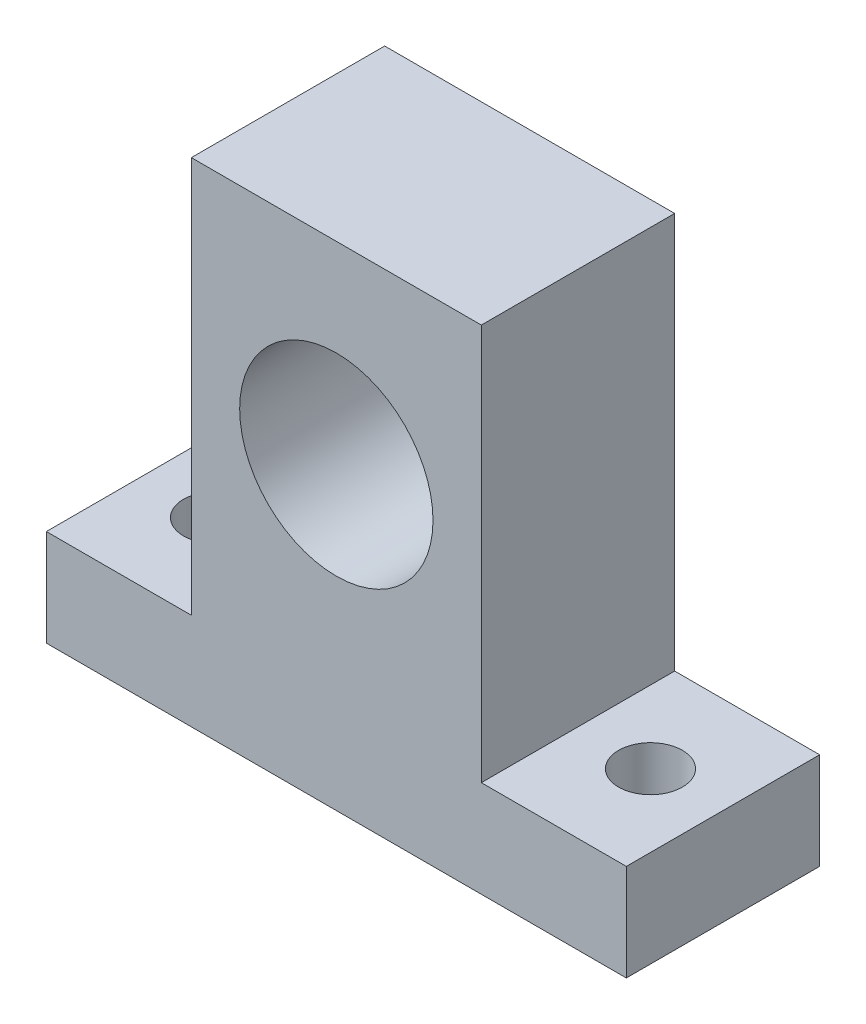
ISO-10303-21;
HEADER;
FILE_DESCRIPTION(('STEP AP214'),'2;1');
FILE_NAME('part.step','',(''),(''),'','','');
FILE_SCHEMA(('AUTOMOTIVE_DESIGN { 1 0 10303 214 1 1 1 1 }'));
ENDSEC;
DATA;
#1=APPLICATION_CONTEXT('core data for automotive mechanical design processes');
#2=APPLICATION_PROTOCOL_DEFINITION('international standard','automotive_design',2000,#1);
#3=PRODUCT_CONTEXT('',#1,'mechanical');
#4=PRODUCT('Part','Part','',(#3));
#5=PRODUCT_RELATED_PRODUCT_CATEGORY('part','',(#4));
#6=PRODUCT_DEFINITION_FORMATION('','',#4);
#7=PRODUCT_DEFINITION_CONTEXT('part definition',#1,'design');
#8=PRODUCT_DEFINITION('design','',#6,#7);
#9=PRODUCT_DEFINITION_SHAPE('','',#8);
#10=(LENGTH_UNIT() NAMED_UNIT(*) SI_UNIT(.MILLI.,.METRE.));
#11=(NAMED_UNIT(*) PLANE_ANGLE_UNIT() SI_UNIT($,.RADIAN.));
#12=(NAMED_UNIT(*) SI_UNIT($,.STERADIAN.) SOLID_ANGLE_UNIT());
#13=UNCERTAINTY_MEASURE_WITH_UNIT(LENGTH_MEASURE(1.E-05),#10,'distance_accuracy_value','');
#14=(GEOMETRIC_REPRESENTATION_CONTEXT(3) GLOBAL_UNCERTAINTY_ASSIGNED_CONTEXT((#13)) GLOBAL_UNIT_ASSIGNED_CONTEXT((#10,
#11,#12)) REPRESENTATION_CONTEXT('',''));
#15=CARTESIAN_POINT('',(0.,0.,0.));
#16=DIRECTION('',(0.,0.,1.));
#17=DIRECTION('',(1.,0.,0.));
#18=AXIS2_PLACEMENT_3D('',#15,#16,#17);
#19=CARTESIAN_POINT('',(0.,0.,20.));
#20=DIRECTION('',(0.,0.,1.));
#21=DIRECTION('',(1.,0.,0.));
#22=AXIS2_PLACEMENT_3D('',#19,#20,#21);
#23=PLANE('',#22);
#24=DIRECTION('',(-1.,0.,0.));
#25=VECTOR('',#24,1.);
#26=CARTESIAN_POINT('',(-15.,10.,20.));
#27=LINE('',#26,#25);
#28=CARTESIAN_POINT('',(-15.,10.,20.));
#29=VERTEX_POINT('',#28);
#30=CARTESIAN_POINT('',(-30.,9.99999999999999,20.));
#31=VERTEX_POINT('',#30);
#32=EDGE_CURVE('E164',#29,#31,#27,.T.);
#33=ORIENTED_EDGE('',*,*,#32,.T.);
#34=DIRECTION('',(0.,-1.,0.));
#35=VECTOR('',#34,1.);
#36=CARTESIAN_POINT('',(-30.,9.99999999999999,20.));
#37=LINE('',#36,#35);
#38=CARTESIAN_POINT('',(-30.,0.,20.));
#39=VERTEX_POINT('',#38);
#40=EDGE_CURVE('E100',#31,#39,#37,.T.);
#41=ORIENTED_EDGE('',*,*,#40,.T.);
#42=DIRECTION('',(1.,0.,0.));
#43=VECTOR('',#42,1.);
#44=CARTESIAN_POINT('',(30.,0.,20.));
#45=LINE('',#44,#43);
#46=CARTESIAN_POINT('',(30.,0.,20.));
#47=VERTEX_POINT('',#46);
#48=EDGE_CURVE('E186',#39,#47,#45,.T.);
#49=ORIENTED_EDGE('',*,*,#48,.T.);
#50=DIRECTION('',(0.,1.,0.));
#51=VECTOR('',#50,1.);
#52=CARTESIAN_POINT('',(30.,10.,20.));
#53=LINE('',#52,#51);
#54=CARTESIAN_POINT('',(30.,10.,20.));
#55=VERTEX_POINT('',#54);
#56=EDGE_CURVE('E200',#47,#55,#53,.T.);
#57=ORIENTED_EDGE('',*,*,#56,.T.);
#58=DIRECTION('',(-1.,0.,0.));
#59=VECTOR('',#58,1.);
#60=CARTESIAN_POINT('',(15.,10.,20.));
#61=LINE('',#60,#59);
#62=CARTESIAN_POINT('',(15.,10.,20.));
#63=VERTEX_POINT('',#62);
#64=EDGE_CURVE('E119',#55,#63,#61,.T.);
#65=ORIENTED_EDGE('',*,*,#64,.T.);
#66=DIRECTION('',(0.,1.,0.));
#67=VECTOR('',#66,1.);
#68=CARTESIAN_POINT('',(15.,51.,20.));
#69=LINE('',#68,#67);
#70=CARTESIAN_POINT('',(15.,51.,20.));
#71=VERTEX_POINT('',#70);
#72=EDGE_CURVE('E113',#63,#71,#69,.T.);
#73=ORIENTED_EDGE('',*,*,#72,.T.);
#74=DIRECTION('',(-1.,0.,0.));
#75=VECTOR('',#74,1.);
#76=CARTESIAN_POINT('',(-15.,51.,20.));
#77=LINE('',#76,#75);
#78=CARTESIAN_POINT('',(-15.,51.,20.));
#79=VERTEX_POINT('',#78);
#80=EDGE_CURVE('E117',#71,#79,#77,.T.);
#81=ORIENTED_EDGE('',*,*,#80,.T.);
#82=DIRECTION('',(0.,-1.,0.));
#83=VECTOR('',#82,1.);
#84=CARTESIAN_POINT('',(-15.,51.,20.));
#85=LINE('',#84,#83);
#86=EDGE_CURVE('E57',#79,#29,#85,.T.);
#87=ORIENTED_EDGE('',*,*,#86,.T.);
#88=EDGE_LOOP('',(#33,#41,#49,#57,#65,#73,#81,#87));
#89=FACE_BOUND('',#88,.T.);
#90=CARTESIAN_POINT('',(0.,31.,20.));
#91=DIRECTION('',(0.,0.,1.));
#92=DIRECTION('',(1.,0.,0.));
#93=AXIS2_PLACEMENT_3D('',#90,#91,#92);
#94=CIRCLE('',#93,10.);
#95=CARTESIAN_POINT('',(10.,31.,20.));
#96=VERTEX_POINT('',#95);
#97=EDGE_CURVE('E146',#96,#96,#94,.T.);
#98=ORIENTED_EDGE('',*,*,#97,.F.);
#99=EDGE_LOOP('',(#98));
#100=FACE_BOUND('',#99,.T.);
#101=ADVANCED_FACE('F38',(#89,#100),#23,.T.);
#102=CARTESIAN_POINT('',(0.,0.,0.));
#103=DIRECTION('',(0.,0.,1.));
#104=DIRECTION('',(1.,0.,0.));
#105=AXIS2_PLACEMENT_3D('',#102,#103,#104);
#106=PLANE('',#105);
#107=DIRECTION('',(-1.,0.,0.));
#108=VECTOR('',#107,1.);
#109=CARTESIAN_POINT('',(-15.,10.,0.));
#110=LINE('',#109,#108);
#111=CARTESIAN_POINT('',(-15.,10.,0.));
#112=VERTEX_POINT('',#111);
#113=CARTESIAN_POINT('',(-30.,9.99999999999999,0.));
#114=VERTEX_POINT('',#113);
#115=EDGE_CURVE('E141',#112,#114,#110,.T.);
#116=ORIENTED_EDGE('',*,*,#115,.F.);
#117=DIRECTION('',(0.,-1.,0.));
#118=VECTOR('',#117,1.);
#119=CARTESIAN_POINT('',(-15.,51.,0.));
#120=LINE('',#119,#118);
#121=CARTESIAN_POINT('',(-15.,51.,0.));
#122=VERTEX_POINT('',#121);
#123=EDGE_CURVE('E92',#122,#112,#120,.T.);
#124=ORIENTED_EDGE('',*,*,#123,.F.);
#125=DIRECTION('',(-1.,0.,0.));
#126=VECTOR('',#125,1.);
#127=CARTESIAN_POINT('',(-15.,51.,0.));
#128=LINE('',#127,#126);
#129=CARTESIAN_POINT('',(15.,51.,0.));
#130=VERTEX_POINT('',#129);
#131=EDGE_CURVE('E86',#130,#122,#128,.T.);
#132=ORIENTED_EDGE('',*,*,#131,.F.);
#133=DIRECTION('',(0.,1.,0.));
#134=VECTOR('',#133,1.);
#135=CARTESIAN_POINT('',(15.,51.,0.));
#136=LINE('',#135,#134);
#137=CARTESIAN_POINT('',(15.,10.,0.));
#138=VERTEX_POINT('',#137);
#139=EDGE_CURVE('E128',#138,#130,#136,.T.);
#140=ORIENTED_EDGE('',*,*,#139,.F.);
#141=DIRECTION('',(-1.,0.,0.));
#142=VECTOR('',#141,1.);
#143=CARTESIAN_POINT('',(15.,10.,0.));
#144=LINE('',#143,#142);
#145=CARTESIAN_POINT('',(30.,10.,0.));
#146=VERTEX_POINT('',#145);
#147=EDGE_CURVE('E155',#146,#138,#144,.T.);
#148=ORIENTED_EDGE('',*,*,#147,.F.);
#149=DIRECTION('',(0.,1.,0.));
#150=VECTOR('',#149,1.);
#151=CARTESIAN_POINT('',(30.,10.,0.));
#152=LINE('',#151,#150);
#153=CARTESIAN_POINT('',(30.,0.,0.));
#154=VERTEX_POINT('',#153);
#155=EDGE_CURVE('E152',#154,#146,#152,.T.);
#156=ORIENTED_EDGE('',*,*,#155,.F.);
#157=DIRECTION('',(1.,0.,0.));
#158=VECTOR('',#157,1.);
#159=CARTESIAN_POINT('',(30.,0.,0.));
#160=LINE('',#159,#158);
#161=CARTESIAN_POINT('',(-30.,0.,0.));
#162=VERTEX_POINT('',#161);
#163=EDGE_CURVE('E149',#162,#154,#160,.T.);
#164=ORIENTED_EDGE('',*,*,#163,.F.);
#165=DIRECTION('',(0.,-1.,0.));
#166=VECTOR('',#165,1.);
#167=CARTESIAN_POINT('',(-30.,9.99999999999999,0.));
#168=LINE('',#167,#166);
#169=EDGE_CURVE('E145',#114,#162,#168,.T.);
#170=ORIENTED_EDGE('',*,*,#169,.F.);
#171=EDGE_LOOP('',(#116,#124,#132,#140,#148,#156,#164,#170));
#172=FACE_BOUND('',#171,.T.);
#173=CARTESIAN_POINT('',(0.,31.,0.));
#174=DIRECTION('',(0.,0.,1.));
#175=DIRECTION('',(1.,0.,0.));
#176=AXIS2_PLACEMENT_3D('',#173,#174,#175);
#177=CIRCLE('',#176,10.);
#178=CARTESIAN_POINT('',(10.,31.,0.));
#179=VERTEX_POINT('',#178);
#180=EDGE_CURVE('E210',#179,#179,#177,.T.);
#181=ORIENTED_EDGE('',*,*,#180,.T.);
#182=EDGE_LOOP('',(#181));
#183=FACE_BOUND('',#182,.T.);
#184=ADVANCED_FACE('F190',(#172,#183),#106,.F.);
#185=CARTESIAN_POINT('',(-15.,10.,20.));
#186=DIRECTION('',(0.,-1.,0.));
#187=DIRECTION('',(1.,0.,0.));
#188=AXIS2_PLACEMENT_3D('',#185,#186,#187);
#189=PLANE('',#188);
#190=CARTESIAN_POINT('',(-22.5,9.99999999999999,10.));
#191=DIRECTION('',(0.,-1.,0.));
#192=DIRECTION('',(1.,0.,0.));
#193=AXIS2_PLACEMENT_3D('',#190,#191,#192);
#194=CIRCLE('',#193,3.3);
#195=CARTESIAN_POINT('',(-19.2,9.99999999999999,10.));
#196=VERTEX_POINT('',#195);
#197=EDGE_CURVE('E214',#196,#196,#194,.T.);
#198=ORIENTED_EDGE('',*,*,#197,.T.);
#199=EDGE_LOOP('',(#198));
#200=FACE_BOUND('',#199,.T.);
#201=ORIENTED_EDGE('',*,*,#115,.T.);
#202=DIRECTION('',(0.,0.,-1.));
#203=VECTOR('',#202,1.);
#204=CARTESIAN_POINT('',(-30.,9.99999999999999,20.));
#205=LINE('',#204,#203);
#206=EDGE_CURVE('E11',#31,#114,#205,.T.);
#207=ORIENTED_EDGE('',*,*,#206,.F.);
#208=ORIENTED_EDGE('',*,*,#32,.F.);
#209=DIRECTION('',(0.,0.,-1.));
#210=VECTOR('',#209,1.);
#211=CARTESIAN_POINT('',(-15.,10.,20.));
#212=LINE('',#211,#210);
#213=EDGE_CURVE('E137',#29,#112,#212,.T.);
#214=ORIENTED_EDGE('',*,*,#213,.T.);
#215=EDGE_LOOP('',(#201,#207,#208,#214));
#216=FACE_BOUND('',#215,.T.);
#217=ADVANCED_FACE('F40',(#200,#216),#189,.F.);
#218=CARTESIAN_POINT('',(-30.,9.99999999999999,20.));
#219=DIRECTION('',(1.,0.,0.));
#220=DIRECTION('',(0.,0.,-1.));
#221=AXIS2_PLACEMENT_3D('',#218,#219,#220);
#222=PLANE('',#221);
#223=ORIENTED_EDGE('',*,*,#169,.T.);
#224=DIRECTION('',(0.,0.,-1.));
#225=VECTOR('',#224,1.);
#226=CARTESIAN_POINT('',(-30.,0.,20.));
#227=LINE('',#226,#225);
#228=EDGE_CURVE('E49',#39,#162,#227,.T.);
#229=ORIENTED_EDGE('',*,*,#228,.F.);
#230=ORIENTED_EDGE('',*,*,#40,.F.);
#231=ORIENTED_EDGE('',*,*,#206,.T.);
#232=EDGE_LOOP('',(#223,#229,#230,#231));
#233=FACE_BOUND('',#232,.T.);
#234=ADVANCED_FACE('F269',(#233),#222,.F.);
#235=CARTESIAN_POINT('',(30.,0.,20.));
#236=DIRECTION('',(0.,1.,0.));
#237=DIRECTION('',(-1.,0.,0.));
#238=AXIS2_PLACEMENT_3D('',#235,#236,#237);
#239=PLANE('',#238);
#240=CARTESIAN_POINT('',(-22.5,0.,10.));
#241=DIRECTION('',(0.,1.,0.));
#242=DIRECTION('',(-1.,0.,0.));
#243=AXIS2_PLACEMENT_3D('',#240,#241,#242);
#244=CIRCLE('',#243,3.3);
#245=CARTESIAN_POINT('',(-25.8,0.,10.));
#246=VERTEX_POINT('',#245);
#247=EDGE_CURVE('E225',#246,#246,#244,.T.);
#248=ORIENTED_EDGE('',*,*,#247,.T.);
#249=EDGE_LOOP('',(#248));
#250=FACE_BOUND('',#249,.T.);
#251=CARTESIAN_POINT('',(22.5,0.,9.99999999999999));
#252=DIRECTION('',(0.,1.,0.));
#253=DIRECTION('',(1.,0.,0.));
#254=AXIS2_PLACEMENT_3D('',#251,#252,#253);
#255=CIRCLE('',#254,3.3);
#256=CARTESIAN_POINT('',(25.8,0.,9.99999999999999));
#257=VERTEX_POINT('',#256);
#258=EDGE_CURVE('E221',#257,#257,#255,.T.);
#259=ORIENTED_EDGE('',*,*,#258,.T.);
#260=EDGE_LOOP('',(#259));
#261=FACE_BOUND('',#260,.T.);
#262=ORIENTED_EDGE('',*,*,#163,.T.);
#263=DIRECTION('',(0.,0.,-1.));
#264=VECTOR('',#263,1.);
#265=CARTESIAN_POINT('',(30.,0.,20.));
#266=LINE('',#265,#264);
#267=EDGE_CURVE('E175',#47,#154,#266,.T.);
#268=ORIENTED_EDGE('',*,*,#267,.F.);
#269=ORIENTED_EDGE('',*,*,#48,.F.);
#270=ORIENTED_EDGE('',*,*,#228,.T.);
#271=EDGE_LOOP('',(#262,#268,#269,#270));
#272=FACE_BOUND('',#271,.T.);
#273=ADVANCED_FACE('F184',(#250,#261,#272),#239,.F.);
#274=CARTESIAN_POINT('',(30.,10.,20.));
#275=DIRECTION('',(-1.,0.,0.));
#276=DIRECTION('',(0.,0.,1.));
#277=AXIS2_PLACEMENT_3D('',#274,#275,#276);
#278=PLANE('',#277);
#279=ORIENTED_EDGE('',*,*,#155,.T.);
#280=DIRECTION('',(0.,0.,-1.));
#281=VECTOR('',#280,1.);
#282=CARTESIAN_POINT('',(30.,10.,20.));
#283=LINE('',#282,#281);
#284=EDGE_CURVE('E171',#55,#146,#283,.T.);
#285=ORIENTED_EDGE('',*,*,#284,.F.);
#286=ORIENTED_EDGE('',*,*,#56,.F.);
#287=ORIENTED_EDGE('',*,*,#267,.T.);
#288=EDGE_LOOP('',(#279,#285,#286,#287));
#289=FACE_BOUND('',#288,.T.);
#290=ADVANCED_FACE('F195',(#289),#278,.F.);
#291=CARTESIAN_POINT('',(15.,10.,20.));
#292=DIRECTION('',(0.,-1.,0.));
#293=DIRECTION('',(0.,0.,-1.));
#294=AXIS2_PLACEMENT_3D('',#291,#292,#293);
#295=PLANE('',#294);
#296=CARTESIAN_POINT('',(22.5,10.,9.99999999999999));
#297=DIRECTION('',(0.,-1.,0.));
#298=DIRECTION('',(0.,0.,-1.));
#299=AXIS2_PLACEMENT_3D('',#296,#297,#298);
#300=CIRCLE('',#299,3.3);
#301=CARTESIAN_POINT('',(22.5,10.,6.69999999999999));
#302=VERTEX_POINT('',#301);
#303=EDGE_CURVE('E42',#302,#302,#300,.T.);
#304=ORIENTED_EDGE('',*,*,#303,.T.);
#305=EDGE_LOOP('',(#304));
#306=FACE_BOUND('',#305,.T.);
#307=ORIENTED_EDGE('',*,*,#147,.T.);
#308=DIRECTION('',(0.,0.,-1.));
#309=VECTOR('',#308,1.);
#310=CARTESIAN_POINT('',(15.,10.,20.));
#311=LINE('',#310,#309);
#312=EDGE_CURVE('E130',#63,#138,#311,.T.);
#313=ORIENTED_EDGE('',*,*,#312,.F.);
#314=ORIENTED_EDGE('',*,*,#64,.F.);
#315=ORIENTED_EDGE('',*,*,#284,.T.);
#316=EDGE_LOOP('',(#307,#313,#314,#315));
#317=FACE_BOUND('',#316,.T.);
#318=ADVANCED_FACE('F198',(#306,#317),#295,.F.);
#319=CARTESIAN_POINT('',(15.,51.,20.));
#320=DIRECTION('',(-1.,0.,0.));
#321=DIRECTION('',(0.,-1.,0.));
#322=AXIS2_PLACEMENT_3D('',#319,#320,#321);
#323=PLANE('',#322);
#324=ORIENTED_EDGE('',*,*,#139,.T.);
#325=DIRECTION('',(0.,0.,-1.));
#326=VECTOR('',#325,1.);
#327=CARTESIAN_POINT('',(15.,51.,20.));
#328=LINE('',#327,#326);
#329=EDGE_CURVE('E125',#71,#130,#328,.T.);
#330=ORIENTED_EDGE('',*,*,#329,.F.);
#331=ORIENTED_EDGE('',*,*,#72,.F.);
#332=ORIENTED_EDGE('',*,*,#312,.T.);
#333=EDGE_LOOP('',(#324,#330,#331,#332));
#334=FACE_BOUND('',#333,.T.);
#335=ADVANCED_FACE('F126',(#334),#323,.F.);
#336=CARTESIAN_POINT('',(-15.,51.,20.));
#337=DIRECTION('',(0.,-1.,0.));
#338=DIRECTION('',(1.,0.,0.));
#339=AXIS2_PLACEMENT_3D('',#336,#337,#338);
#340=PLANE('',#339);
#341=ORIENTED_EDGE('',*,*,#131,.T.);
#342=DIRECTION('',(0.,0.,-1.));
#343=VECTOR('',#342,1.);
#344=CARTESIAN_POINT('',(-15.,51.,20.));
#345=LINE('',#344,#343);
#346=EDGE_CURVE('E131',#79,#122,#345,.T.);
#347=ORIENTED_EDGE('',*,*,#346,.F.);
#348=ORIENTED_EDGE('',*,*,#80,.F.);
#349=ORIENTED_EDGE('',*,*,#329,.T.);
#350=EDGE_LOOP('',(#341,#347,#348,#349));
#351=FACE_BOUND('',#350,.T.);
#352=ADVANCED_FACE('F133',(#351),#340,.F.);
#353=CARTESIAN_POINT('',(-15.,51.,20.));
#354=DIRECTION('',(1.,0.,0.));
#355=DIRECTION('',(0.,1.,0.));
#356=AXIS2_PLACEMENT_3D('',#353,#354,#355);
#357=PLANE('',#356);
#358=ORIENTED_EDGE('',*,*,#123,.T.);
#359=ORIENTED_EDGE('',*,*,#213,.F.);
#360=ORIENTED_EDGE('',*,*,#86,.F.);
#361=ORIENTED_EDGE('',*,*,#346,.T.);
#362=EDGE_LOOP('',(#358,#359,#360,#361));
#363=FACE_BOUND('',#362,.T.);
#364=ADVANCED_FACE('F247',(#363),#357,.F.);
#365=CARTESIAN_POINT('',(0.,31.,20.));
#366=DIRECTION('',(0.,0.,-1.));
#367=DIRECTION('',(-1.,0.,0.));
#368=AXIS2_PLACEMENT_3D('',#365,#366,#367);
#369=CYLINDRICAL_SURFACE('',#368,10.);
#370=ORIENTED_EDGE('',*,*,#97,.T.);
#371=EDGE_LOOP('',(#370));
#372=FACE_BOUND('',#371,.T.);
#373=ORIENTED_EDGE('',*,*,#180,.F.);
#374=EDGE_LOOP('',(#373));
#375=FACE_BOUND('',#374,.T.);
#376=ADVANCED_FACE('F238',(#372,#375),#369,.F.);
#377=CARTESIAN_POINT('',(22.5,0.,9.99999999999999));
#378=DIRECTION('',(0.,1.,0.));
#379=DIRECTION('',(-1.,0.,0.));
#380=AXIS2_PLACEMENT_3D('',#377,#378,#379);
#381=CYLINDRICAL_SURFACE('',#380,3.3);
#382=ORIENTED_EDGE('',*,*,#258,.F.);
#383=EDGE_LOOP('',(#382));
#384=FACE_BOUND('',#383,.T.);
#385=ORIENTED_EDGE('',*,*,#303,.F.);
#386=EDGE_LOOP('',(#385));
#387=FACE_BOUND('',#386,.T.);
#388=ADVANCED_FACE('F235',(#384,#387),#381,.F.);
#389=CARTESIAN_POINT('',(-22.5,0.,10.));
#390=DIRECTION('',(0.,1.,0.));
#391=DIRECTION('',(-1.,0.,0.));
#392=AXIS2_PLACEMENT_3D('',#389,#390,#391);
#393=CYLINDRICAL_SURFACE('',#392,3.3);
#394=ORIENTED_EDGE('',*,*,#247,.F.);
#395=EDGE_LOOP('',(#394));
#396=FACE_BOUND('',#395,.T.);
#397=ORIENTED_EDGE('',*,*,#197,.F.);
#398=EDGE_LOOP('',(#397));
#399=FACE_BOUND('',#398,.T.);
#400=ADVANCED_FACE('F237',(#396,#399),#393,.F.);
#401=CLOSED_SHELL('',(#101,#184,#217,#234,#273,#290,#318,#335,#352,#364,#376,#388,#400));
#402=MANIFOLD_SOLID_BREP('B2',#401);
#403=ADVANCED_BREP_SHAPE_REPRESENTATION('',(#18,#402),#14);
#404=SHAPE_DEFINITION_REPRESENTATION(#9,#403);
ENDSEC;
END-ISO-10303-21;
